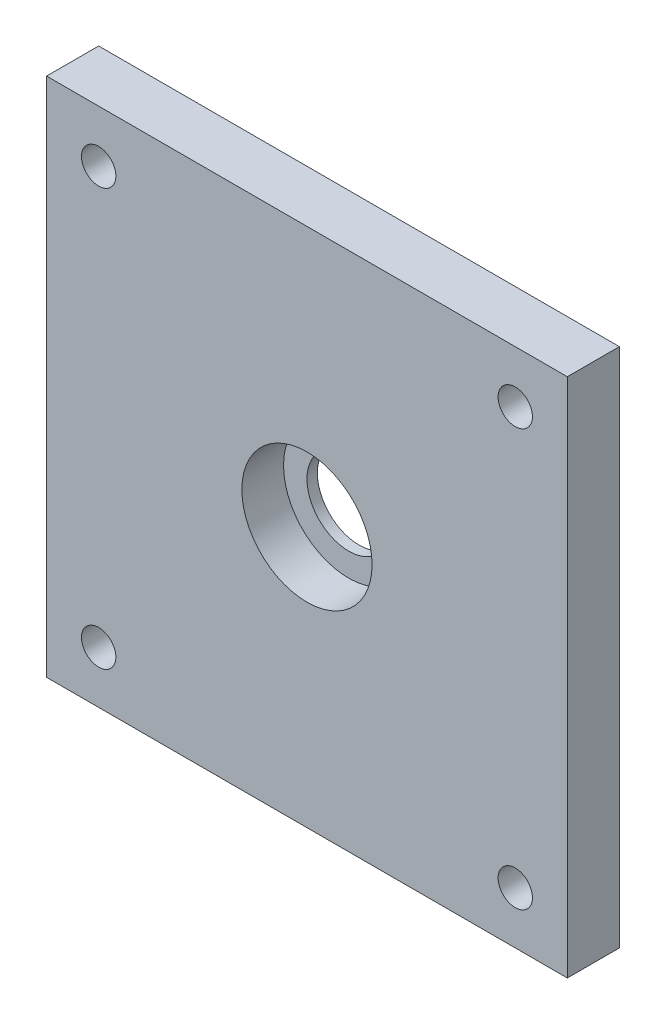
ISO-10303-21;
HEADER;
FILE_DESCRIPTION(('STEP AP214'),'2;1');
FILE_NAME('part.step','',(''),(''),'','','');
FILE_SCHEMA(('AUTOMOTIVE_DESIGN { 1 0 10303 214 1 1 1 1 }'));
ENDSEC;
DATA;
#1=APPLICATION_CONTEXT('core data for automotive mechanical design processes');
#2=APPLICATION_PROTOCOL_DEFINITION('international standard','automotive_design',2000,#1);
#3=PRODUCT_CONTEXT('',#1,'mechanical');
#4=PRODUCT('Part','Part','',(#3));
#5=PRODUCT_RELATED_PRODUCT_CATEGORY('part','',(#4));
#6=PRODUCT_DEFINITION_FORMATION('','',#4);
#7=PRODUCT_DEFINITION_CONTEXT('part definition',#1,'design');
#8=PRODUCT_DEFINITION('design','',#6,#7);
#9=PRODUCT_DEFINITION_SHAPE('','',#8);
#10=(LENGTH_UNIT() NAMED_UNIT(*) SI_UNIT(.MILLI.,.METRE.));
#11=(NAMED_UNIT(*) PLANE_ANGLE_UNIT() SI_UNIT($,.RADIAN.));
#12=(NAMED_UNIT(*) SI_UNIT($,.STERADIAN.) SOLID_ANGLE_UNIT());
#13=UNCERTAINTY_MEASURE_WITH_UNIT(LENGTH_MEASURE(1.E-05),#10,'distance_accuracy_value','');
#14=(GEOMETRIC_REPRESENTATION_CONTEXT(3) GLOBAL_UNCERTAINTY_ASSIGNED_CONTEXT((#13)) GLOBAL_UNIT_ASSIGNED_CONTEXT((#10,
#11,#12)) REPRESENTATION_CONTEXT('',''));
#15=CARTESIAN_POINT('',(0.,0.,0.));
#16=DIRECTION('',(0.,0.,1.));
#17=DIRECTION('',(1.,0.,0.));
#18=AXIS2_PLACEMENT_3D('',#15,#16,#17);
#19=CARTESIAN_POINT('',(0.,0.,5.));
#20=DIRECTION('',(0.,0.,-1.));
#21=DIRECTION('',(-1.,0.,0.));
#22=AXIS2_PLACEMENT_3D('',#19,#20,#21);
#23=CYLINDRICAL_SURFACE('',#22,6.25);
#24=CARTESIAN_POINT('',(0.,0.,5.));
#25=DIRECTION('',(0.,0.,1.));
#26=DIRECTION('',(1.,0.,0.));
#27=AXIS2_PLACEMENT_3D('',#24,#25,#26);
#28=CIRCLE('',#27,6.25);
#29=CARTESIAN_POINT('',(6.25,0.,5.));
#30=VERTEX_POINT('',#29);
#31=EDGE_CURVE('E135',#30,#30,#28,.T.);
#32=ORIENTED_EDGE('',*,*,#31,.T.);
#33=EDGE_LOOP('',(#32));
#34=FACE_BOUND('',#33,.T.);
#35=CARTESIAN_POINT('',(0.,0.,1.));
#36=DIRECTION('',(0.,0.,-1.));
#37=DIRECTION('',(-1.,0.,0.));
#38=AXIS2_PLACEMENT_3D('',#35,#36,#37);
#39=CIRCLE('',#38,6.25);
#40=CARTESIAN_POINT('',(-6.25,0.,1.));
#41=VERTEX_POINT('',#40);
#42=EDGE_CURVE('E163',#41,#41,#39,.T.);
#43=ORIENTED_EDGE('',*,*,#42,.T.);
#44=EDGE_LOOP('',(#43));
#45=FACE_BOUND('',#44,.T.);
#46=ADVANCED_FACE('F39',(#34,#45),#23,.F.);
#47=CARTESIAN_POINT('',(0.,0.,5.));
#48=DIRECTION('',(0.,0.,-1.));
#49=DIRECTION('',(-1.,0.,0.));
#50=AXIS2_PLACEMENT_3D('',#47,#48,#49);
#51=PLANE('',#50);
#52=DIRECTION('',(0.,1.,0.));
#53=VECTOR('',#52,1.);
#54=CARTESIAN_POINT('',(25.,-25.,5.));
#55=LINE('',#54,#53);
#56=CARTESIAN_POINT('',(25.,-25.,5.));
#57=VERTEX_POINT('',#56);
#58=CARTESIAN_POINT('',(25.,25.,5.));
#59=VERTEX_POINT('',#58);
#60=EDGE_CURVE('E93',#57,#59,#55,.T.);
#61=ORIENTED_EDGE('',*,*,#60,.T.);
#62=DIRECTION('',(-1.,0.,0.));
#63=VECTOR('',#62,1.);
#64=CARTESIAN_POINT('',(-25.,25.,5.));
#65=LINE('',#64,#63);
#66=CARTESIAN_POINT('',(-25.,25.,5.));
#67=VERTEX_POINT('',#66);
#68=EDGE_CURVE('E87',#59,#67,#65,.T.);
#69=ORIENTED_EDGE('',*,*,#68,.T.);
#70=DIRECTION('',(0.,-1.,0.));
#71=VECTOR('',#70,1.);
#72=CARTESIAN_POINT('',(-25.,-25.,5.));
#73=LINE('',#72,#71);
#74=CARTESIAN_POINT('',(-25.,-25.,5.));
#75=VERTEX_POINT('',#74);
#76=EDGE_CURVE('E91',#67,#75,#73,.T.);
#77=ORIENTED_EDGE('',*,*,#76,.T.);
#78=DIRECTION('',(1.,0.,0.));
#79=VECTOR('',#78,1.);
#80=CARTESIAN_POINT('',(-25.,-25.,5.));
#81=LINE('',#80,#79);
#82=EDGE_CURVE('E57',#75,#57,#81,.T.);
#83=ORIENTED_EDGE('',*,*,#82,.T.);
#84=EDGE_LOOP('',(#61,#69,#77,#83));
#85=FACE_BOUND('',#84,.T.);
#86=CARTESIAN_POINT('',(-20.,-20.,5.));
#87=DIRECTION('',(0.,0.,1.));
#88=DIRECTION('',(1.,0.,0.));
#89=AXIS2_PLACEMENT_3D('',#86,#87,#88);
#90=CIRCLE('',#89,1.65);
#91=CARTESIAN_POINT('',(-18.35,-20.,5.));
#92=VERTEX_POINT('',#91);
#93=EDGE_CURVE('E113',#92,#92,#90,.T.);
#94=ORIENTED_EDGE('',*,*,#93,.F.);
#95=EDGE_LOOP('',(#94));
#96=FACE_BOUND('',#95,.T.);
#97=ORIENTED_EDGE('',*,*,#31,.F.);
#98=EDGE_LOOP('',(#97));
#99=FACE_BOUND('',#98,.T.);
#100=CARTESIAN_POINT('',(-19.9999999999999,20.0000000000001,5.));
#101=DIRECTION('',(0.,0.,1.));
#102=DIRECTION('',(1.,0.,0.));
#103=AXIS2_PLACEMENT_3D('',#100,#101,#102);
#104=CIRCLE('',#103,1.65);
#105=CARTESIAN_POINT('',(-18.3499999999999,20.0000000000001,5.));
#106=VERTEX_POINT('',#105);
#107=EDGE_CURVE('E142',#106,#106,#104,.T.);
#108=ORIENTED_EDGE('',*,*,#107,.F.);
#109=EDGE_LOOP('',(#108));
#110=FACE_BOUND('',#109,.T.);
#111=CARTESIAN_POINT('',(20.0000000000001,19.9999999999999,5.));
#112=DIRECTION('',(0.,0.,1.));
#113=DIRECTION('',(1.,0.,0.));
#114=AXIS2_PLACEMENT_3D('',#111,#112,#113);
#115=CIRCLE('',#114,1.65);
#116=CARTESIAN_POINT('',(21.6500000000001,19.9999999999999,5.));
#117=VERTEX_POINT('',#116);
#118=EDGE_CURVE('E147',#117,#117,#115,.T.);
#119=ORIENTED_EDGE('',*,*,#118,.F.);
#120=EDGE_LOOP('',(#119));
#121=FACE_BOUND('',#120,.T.);
#122=CARTESIAN_POINT('',(19.9999999999998,-20.0000000000002,5.));
#123=DIRECTION('',(0.,0.,1.));
#124=DIRECTION('',(1.,0.,0.));
#125=AXIS2_PLACEMENT_3D('',#122,#123,#124);
#126=CIRCLE('',#125,1.65);
#127=CARTESIAN_POINT('',(21.6499999999998,-20.0000000000002,5.));
#128=VERTEX_POINT('',#127);
#129=EDGE_CURVE('E155',#128,#128,#126,.T.);
#130=ORIENTED_EDGE('',*,*,#129,.F.);
#131=EDGE_LOOP('',(#130));
#132=FACE_BOUND('',#131,.T.);
#133=ADVANCED_FACE('F88',(#85,#96,#99,#110,#121,#132),#51,.F.);
#134=CARTESIAN_POINT('',(0.,0.,0.));
#135=DIRECTION('',(0.,0.,-1.));
#136=DIRECTION('',(-1.,0.,0.));
#137=AXIS2_PLACEMENT_3D('',#134,#135,#136);
#138=PLANE('',#137);
#139=CARTESIAN_POINT('',(20.0000000000001,19.9999999999999,0.));
#140=DIRECTION('',(0.,0.,1.));
#141=DIRECTION('',(1.,0.,0.));
#142=AXIS2_PLACEMENT_3D('',#139,#140,#141);
#143=CIRCLE('',#142,1.65);
#144=CARTESIAN_POINT('',(21.6500000000001,19.9999999999999,0.));
#145=VERTEX_POINT('',#144);
#146=EDGE_CURVE('E151',#145,#145,#143,.T.);
#147=ORIENTED_EDGE('',*,*,#146,.T.);
#148=EDGE_LOOP('',(#147));
#149=FACE_BOUND('',#148,.T.);
#150=DIRECTION('',(0.,1.,0.));
#151=VECTOR('',#150,1.);
#152=CARTESIAN_POINT('',(25.,-25.,0.));
#153=LINE('',#152,#151);
#154=CARTESIAN_POINT('',(25.,-25.,0.));
#155=VERTEX_POINT('',#154);
#156=CARTESIAN_POINT('',(25.,25.,0.));
#157=VERTEX_POINT('',#156);
#158=EDGE_CURVE('E109',#155,#157,#153,.T.);
#159=ORIENTED_EDGE('',*,*,#158,.F.);
#160=DIRECTION('',(1.,0.,0.));
#161=VECTOR('',#160,1.);
#162=CARTESIAN_POINT('',(-25.,-25.,0.));
#163=LINE('',#162,#161);
#164=CARTESIAN_POINT('',(-25.,-25.,0.));
#165=VERTEX_POINT('',#164);
#166=EDGE_CURVE('E80',#165,#155,#163,.T.);
#167=ORIENTED_EDGE('',*,*,#166,.F.);
#168=DIRECTION('',(0.,-1.,0.));
#169=VECTOR('',#168,1.);
#170=CARTESIAN_POINT('',(-25.,-25.,0.));
#171=LINE('',#170,#169);
#172=CARTESIAN_POINT('',(-25.,25.,0.));
#173=VERTEX_POINT('',#172);
#174=EDGE_CURVE('E74',#173,#165,#171,.T.);
#175=ORIENTED_EDGE('',*,*,#174,.F.);
#176=DIRECTION('',(-1.,0.,0.));
#177=VECTOR('',#176,1.);
#178=CARTESIAN_POINT('',(-25.,25.,0.));
#179=LINE('',#178,#177);
#180=EDGE_CURVE('E98',#157,#173,#179,.T.);
#181=ORIENTED_EDGE('',*,*,#180,.F.);
#182=EDGE_LOOP('',(#159,#167,#175,#181));
#183=FACE_BOUND('',#182,.T.);
#184=CARTESIAN_POINT('',(-20.,-20.,0.));
#185=DIRECTION('',(0.,0.,1.));
#186=DIRECTION('',(1.,0.,0.));
#187=AXIS2_PLACEMENT_3D('',#184,#185,#186);
#188=CIRCLE('',#187,1.65);
#189=CARTESIAN_POINT('',(-18.35,-20.,0.));
#190=VERTEX_POINT('',#189);
#191=EDGE_CURVE('E131',#190,#190,#188,.T.);
#192=ORIENTED_EDGE('',*,*,#191,.T.);
#193=EDGE_LOOP('',(#192));
#194=FACE_BOUND('',#193,.T.);
#195=CARTESIAN_POINT('',(-19.9999999999999,20.0000000000001,0.));
#196=DIRECTION('',(0.,0.,1.));
#197=DIRECTION('',(1.,0.,0.));
#198=AXIS2_PLACEMENT_3D('',#195,#196,#197);
#199=CIRCLE('',#198,1.65);
#200=CARTESIAN_POINT('',(-18.3499999999999,20.0000000000001,0.));
#201=VERTEX_POINT('',#200);
#202=EDGE_CURVE('E143',#201,#201,#199,.T.);
#203=ORIENTED_EDGE('',*,*,#202,.T.);
#204=EDGE_LOOP('',(#203));
#205=FACE_BOUND('',#204,.T.);
#206=CARTESIAN_POINT('',(19.9999999999998,-20.0000000000002,0.));
#207=DIRECTION('',(0.,0.,1.));
#208=DIRECTION('',(1.,0.,0.));
#209=AXIS2_PLACEMENT_3D('',#206,#207,#208);
#210=CIRCLE('',#209,1.65);
#211=CARTESIAN_POINT('',(21.6499999999998,-20.0000000000002,0.));
#212=VERTEX_POINT('',#211);
#213=EDGE_CURVE('E159',#212,#212,#210,.T.);
#214=ORIENTED_EDGE('',*,*,#213,.T.);
#215=EDGE_LOOP('',(#214));
#216=FACE_BOUND('',#215,.T.);
#217=CARTESIAN_POINT('',(0.,0.,0.));
#218=DIRECTION('',(0.,0.,-1.));
#219=DIRECTION('',(-1.,0.,0.));
#220=AXIS2_PLACEMENT_3D('',#217,#218,#219);
#221=CIRCLE('',#220,4.);
#222=CARTESIAN_POINT('',(-4.,0.,0.));
#223=VERTEX_POINT('',#222);
#224=EDGE_CURVE('E171',#223,#223,#221,.T.);
#225=ORIENTED_EDGE('',*,*,#224,.F.);
#226=EDGE_LOOP('',(#225));
#227=FACE_BOUND('',#226,.T.);
#228=ADVANCED_FACE('F126',(#149,#183,#194,#205,#216,#227),#138,.T.);
#229=CARTESIAN_POINT('',(25.,-25.,5.));
#230=DIRECTION('',(-1.,0.,0.));
#231=DIRECTION('',(0.,0.,1.));
#232=AXIS2_PLACEMENT_3D('',#229,#230,#231);
#233=PLANE('',#232);
#234=ORIENTED_EDGE('',*,*,#158,.T.);
#235=DIRECTION('',(0.,0.,-1.));
#236=VECTOR('',#235,1.);
#237=CARTESIAN_POINT('',(25.,25.,5.));
#238=LINE('',#237,#236);
#239=EDGE_CURVE('E11',#59,#157,#238,.T.);
#240=ORIENTED_EDGE('',*,*,#239,.F.);
#241=ORIENTED_EDGE('',*,*,#60,.F.);
#242=DIRECTION('',(0.,0.,-1.));
#243=VECTOR('',#242,1.);
#244=CARTESIAN_POINT('',(25.,-25.,5.));
#245=LINE('',#244,#243);
#246=EDGE_CURVE('E105',#57,#155,#245,.T.);
#247=ORIENTED_EDGE('',*,*,#246,.T.);
#248=EDGE_LOOP('',(#234,#240,#241,#247));
#249=FACE_BOUND('',#248,.T.);
#250=ADVANCED_FACE('F41',(#249),#233,.F.);
#251=CARTESIAN_POINT('',(-25.,25.,5.));
#252=DIRECTION('',(0.,-1.,0.));
#253=DIRECTION('',(0.,0.,-1.));
#254=AXIS2_PLACEMENT_3D('',#251,#252,#253);
#255=PLANE('',#254);
#256=ORIENTED_EDGE('',*,*,#180,.T.);
#257=DIRECTION('',(0.,0.,-1.));
#258=VECTOR('',#257,1.);
#259=CARTESIAN_POINT('',(-25.,25.,5.));
#260=LINE('',#259,#258);
#261=EDGE_CURVE('E49',#67,#173,#260,.T.);
#262=ORIENTED_EDGE('',*,*,#261,.F.);
#263=ORIENTED_EDGE('',*,*,#68,.F.);
#264=ORIENTED_EDGE('',*,*,#239,.T.);
#265=EDGE_LOOP('',(#256,#262,#263,#264));
#266=FACE_BOUND('',#265,.T.);
#267=ADVANCED_FACE('F97',(#266),#255,.F.);
#268=CARTESIAN_POINT('',(-25.,-25.,5.));
#269=DIRECTION('',(1.,0.,0.));
#270=DIRECTION('',(0.,0.,-1.));
#271=AXIS2_PLACEMENT_3D('',#268,#269,#270);
#272=PLANE('',#271);
#273=ORIENTED_EDGE('',*,*,#174,.T.);
#274=DIRECTION('',(0.,0.,-1.));
#275=VECTOR('',#274,1.);
#276=CARTESIAN_POINT('',(-25.,-25.,5.));
#277=LINE('',#276,#275);
#278=EDGE_CURVE('E100',#75,#165,#277,.T.);
#279=ORIENTED_EDGE('',*,*,#278,.F.);
#280=ORIENTED_EDGE('',*,*,#76,.F.);
#281=ORIENTED_EDGE('',*,*,#261,.T.);
#282=EDGE_LOOP('',(#273,#279,#280,#281));
#283=FACE_BOUND('',#282,.T.);
#284=ADVANCED_FACE('F101',(#283),#272,.F.);
#285=CARTESIAN_POINT('',(-25.,-25.,5.));
#286=DIRECTION('',(0.,1.,0.));
#287=DIRECTION('',(0.,0.,1.));
#288=AXIS2_PLACEMENT_3D('',#285,#286,#287);
#289=PLANE('',#288);
#290=ORIENTED_EDGE('',*,*,#166,.T.);
#291=ORIENTED_EDGE('',*,*,#246,.F.);
#292=ORIENTED_EDGE('',*,*,#82,.F.);
#293=ORIENTED_EDGE('',*,*,#278,.T.);
#294=EDGE_LOOP('',(#290,#291,#292,#293));
#295=FACE_BOUND('',#294,.T.);
#296=ADVANCED_FACE('F123',(#295),#289,.F.);
#297=CARTESIAN_POINT('',(-20.,-20.,5.));
#298=DIRECTION('',(0.,0.,-1.));
#299=DIRECTION('',(-1.,0.,0.));
#300=AXIS2_PLACEMENT_3D('',#297,#298,#299);
#301=CYLINDRICAL_SURFACE('',#300,1.65);
#302=ORIENTED_EDGE('',*,*,#93,.T.);
#303=EDGE_LOOP('',(#302));
#304=FACE_BOUND('',#303,.T.);
#305=ORIENTED_EDGE('',*,*,#191,.F.);
#306=EDGE_LOOP('',(#305));
#307=FACE_BOUND('',#306,.T.);
#308=ADVANCED_FACE('F207',(#304,#307),#301,.F.);
#309=CARTESIAN_POINT('',(-19.9999999999999,20.0000000000001,5.));
#310=DIRECTION('',(0.,0.,-1.));
#311=DIRECTION('',(-1.,0.,0.));
#312=AXIS2_PLACEMENT_3D('',#309,#310,#311);
#313=CYLINDRICAL_SURFACE('',#312,1.65);
#314=ORIENTED_EDGE('',*,*,#107,.T.);
#315=EDGE_LOOP('',(#314));
#316=FACE_BOUND('',#315,.T.);
#317=ORIENTED_EDGE('',*,*,#202,.F.);
#318=EDGE_LOOP('',(#317));
#319=FACE_BOUND('',#318,.T.);
#320=ADVANCED_FACE('F205',(#316,#319),#313,.F.);
#321=CARTESIAN_POINT('',(20.0000000000001,19.9999999999999,5.));
#322=DIRECTION('',(0.,0.,-1.));
#323=DIRECTION('',(-1.,0.,0.));
#324=AXIS2_PLACEMENT_3D('',#321,#322,#323);
#325=CYLINDRICAL_SURFACE('',#324,1.65);
#326=ORIENTED_EDGE('',*,*,#118,.T.);
#327=EDGE_LOOP('',(#326));
#328=FACE_BOUND('',#327,.T.);
#329=ORIENTED_EDGE('',*,*,#146,.F.);
#330=EDGE_LOOP('',(#329));
#331=FACE_BOUND('',#330,.T.);
#332=ADVANCED_FACE('F214',(#328,#331),#325,.F.);
#333=CARTESIAN_POINT('',(19.9999999999998,-20.0000000000002,5.));
#334=DIRECTION('',(0.,0.,-1.));
#335=DIRECTION('',(-1.,0.,0.));
#336=AXIS2_PLACEMENT_3D('',#333,#334,#335);
#337=CYLINDRICAL_SURFACE('',#336,1.65);
#338=ORIENTED_EDGE('',*,*,#129,.T.);
#339=EDGE_LOOP('',(#338));
#340=FACE_BOUND('',#339,.T.);
#341=ORIENTED_EDGE('',*,*,#213,.F.);
#342=EDGE_LOOP('',(#341));
#343=FACE_BOUND('',#342,.T.);
#344=ADVANCED_FACE('F224',(#340,#343),#337,.F.);
#345=CARTESIAN_POINT('',(0.,0.,1.));
#346=DIRECTION('',(0.,0.,-1.));
#347=DIRECTION('',(-1.,0.,0.));
#348=AXIS2_PLACEMENT_3D('',#345,#346,#347);
#349=PLANE('',#348);
#350=CARTESIAN_POINT('',(0.,0.,1.));
#351=DIRECTION('',(0.,0.,-1.));
#352=DIRECTION('',(-1.,0.,0.));
#353=AXIS2_PLACEMENT_3D('',#350,#351,#352);
#354=CIRCLE('',#353,4.);
#355=CARTESIAN_POINT('',(-4.,0.,1.));
#356=VERTEX_POINT('',#355);
#357=EDGE_CURVE('E170',#356,#356,#354,.T.);
#358=ORIENTED_EDGE('',*,*,#357,.T.);
#359=EDGE_LOOP('',(#358));
#360=FACE_BOUND('',#359,.T.);
#361=ORIENTED_EDGE('',*,*,#42,.F.);
#362=EDGE_LOOP('',(#361));
#363=FACE_BOUND('',#362,.T.);
#364=ADVANCED_FACE('F179',(#360,#363),#349,.F.);
#365=CARTESIAN_POINT('',(0.,0.,1.));
#366=DIRECTION('',(0.,0.,-1.));
#367=DIRECTION('',(-1.,0.,0.));
#368=AXIS2_PLACEMENT_3D('',#365,#366,#367);
#369=CYLINDRICAL_SURFACE('',#368,4.);
#370=ORIENTED_EDGE('',*,*,#357,.F.);
#371=EDGE_LOOP('',(#370));
#372=FACE_BOUND('',#371,.T.);
#373=ORIENTED_EDGE('',*,*,#224,.T.);
#374=EDGE_LOOP('',(#373));
#375=FACE_BOUND('',#374,.T.);
#376=ADVANCED_FACE('F182',(#372,#375),#369,.F.);
#377=CLOSED_SHELL('',(#46,#133,#228,#250,#267,#284,#296,#308,#320,#332,#344,#364,#376));
#378=MANIFOLD_SOLID_BREP('B2',#377);
#379=ADVANCED_BREP_SHAPE_REPRESENTATION('',(#18,#378),#14);
#380=SHAPE_DEFINITION_REPRESENTATION(#9,#379);
ENDSEC;
END-ISO-10303-21;
